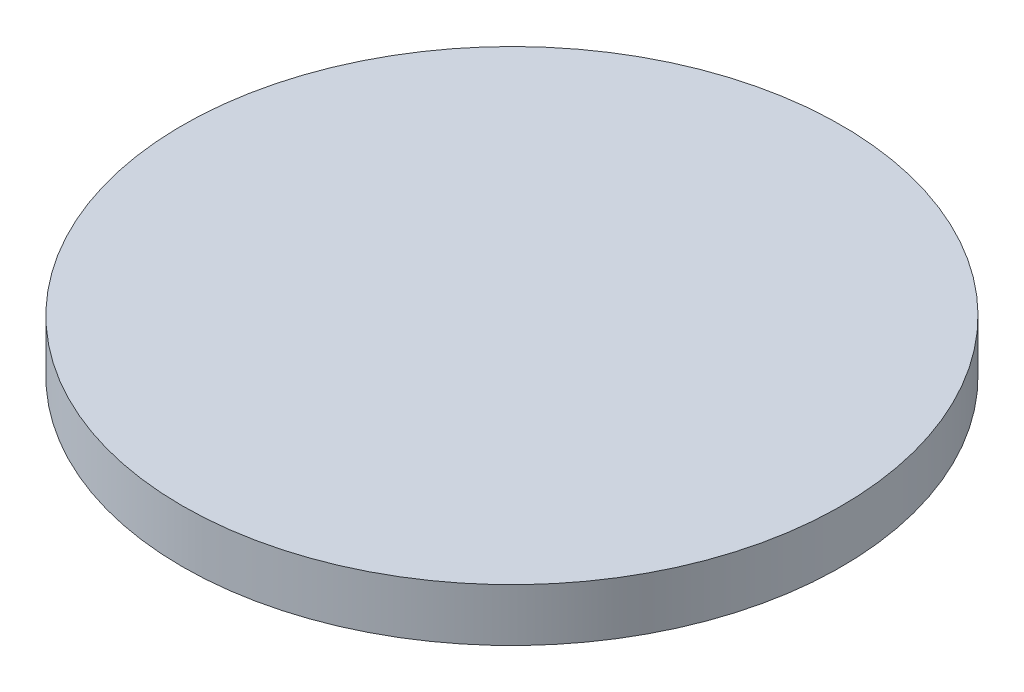
ISO-10303-21;
HEADER;
FILE_DESCRIPTION(('STEP AP214'),'2;1');
FILE_NAME('part.step','',(''),(''),'','','');
FILE_SCHEMA(('AUTOMOTIVE_DESIGN { 1 0 10303 214 1 1 1 1 }'));
ENDSEC;
DATA;
#1=APPLICATION_CONTEXT('core data for automotive mechanical design processes');
#2=APPLICATION_PROTOCOL_DEFINITION('international standard','automotive_design',2000,#1);
#3=PRODUCT_CONTEXT('',#1,'mechanical');
#4=PRODUCT('Part','Part','',(#3));
#5=PRODUCT_RELATED_PRODUCT_CATEGORY('part','',(#4));
#6=PRODUCT_DEFINITION_FORMATION('','',#4);
#7=PRODUCT_DEFINITION_CONTEXT('part definition',#1,'design');
#8=PRODUCT_DEFINITION('design','',#6,#7);
#9=PRODUCT_DEFINITION_SHAPE('','',#8);
#10=(LENGTH_UNIT() NAMED_UNIT(*) SI_UNIT(.MILLI.,.METRE.));
#11=(NAMED_UNIT(*) PLANE_ANGLE_UNIT() SI_UNIT($,.RADIAN.));
#12=(NAMED_UNIT(*) SI_UNIT($,.STERADIAN.) SOLID_ANGLE_UNIT());
#13=UNCERTAINTY_MEASURE_WITH_UNIT(LENGTH_MEASURE(1.E-05),#10,'distance_accuracy_value','');
#14=(GEOMETRIC_REPRESENTATION_CONTEXT(3) GLOBAL_UNCERTAINTY_ASSIGNED_CONTEXT((#13)) GLOBAL_UNIT_ASSIGNED_CONTEXT((#10,
#11,#12)) REPRESENTATION_CONTEXT('',''));
#15=CARTESIAN_POINT('',(0.,0.,0.));
#16=DIRECTION('',(0.,0.,1.));
#17=DIRECTION('',(1.,0.,0.));
#18=AXIS2_PLACEMENT_3D('',#15,#16,#17);
#19=CARTESIAN_POINT('',(0.,0.,0.));
#20=DIRECTION('',(0.,1.,0.));
#21=DIRECTION('',(0.,0.,1.));
#22=AXIS2_PLACEMENT_3D('',#19,#20,#21);
#23=PLANE('',#22);
#24=CARTESIAN_POINT('',(0.,0.,0.));
#25=DIRECTION('',(0.,1.,0.));
#26=DIRECTION('',(0.,0.,1.));
#27=AXIS2_PLACEMENT_3D('',#24,#25,#26);
#28=CIRCLE('',#27,25.);
#29=CARTESIAN_POINT('',(0.,0.,25.));
#30=VERTEX_POINT('',#29);
#31=EDGE_CURVE('E37',#30,#30,#28,.T.);
#32=ORIENTED_EDGE('',*,*,#31,.F.);
#33=EDGE_LOOP('',(#32));
#34=FACE_BOUND('',#33,.T.);
#35=CARTESIAN_POINT('',(0.,0.,0.));
#36=DIRECTION('',(0.,-1.,0.));
#37=DIRECTION('',(0.,0.,-1.));
#38=AXIS2_PLACEMENT_3D('',#35,#36,#37);
#39=CIRCLE('',#38,4.);
#40=CARTESIAN_POINT('',(0.,0.,-4.));
#41=VERTEX_POINT('',#40);
#42=EDGE_CURVE('E11',#41,#41,#39,.T.);
#43=ORIENTED_EDGE('',*,*,#42,.F.);
#44=EDGE_LOOP('',(#43));
#45=FACE_BOUND('',#44,.T.);
#46=ADVANCED_FACE('F33',(#34,#45),#23,.F.);
#47=CARTESIAN_POINT('',(0.,4.,0.));
#48=DIRECTION('',(0.,-1.,0.));
#49=DIRECTION('',(0.,0.,-1.));
#50=AXIS2_PLACEMENT_3D('',#47,#48,#49);
#51=CYLINDRICAL_SURFACE('',#50,25.);
#52=CARTESIAN_POINT('',(0.,4.,0.));
#53=DIRECTION('',(0.,1.,0.));
#54=DIRECTION('',(0.,0.,1.));
#55=AXIS2_PLACEMENT_3D('',#52,#53,#54);
#56=CIRCLE('',#55,25.);
#57=CARTESIAN_POINT('',(0.,4.,25.));
#58=VERTEX_POINT('',#57);
#59=EDGE_CURVE('E42',#58,#58,#56,.T.);
#60=ORIENTED_EDGE('',*,*,#59,.F.);
#61=EDGE_LOOP('',(#60));
#62=FACE_BOUND('',#61,.T.);
#63=ORIENTED_EDGE('',*,*,#31,.T.);
#64=EDGE_LOOP('',(#63));
#65=FACE_BOUND('',#64,.T.);
#66=ADVANCED_FACE('F35',(#62,#65),#51,.T.);
#67=CARTESIAN_POINT('',(0.,4.,0.));
#68=DIRECTION('',(0.,1.,0.));
#69=DIRECTION('',(0.,0.,1.));
#70=AXIS2_PLACEMENT_3D('',#67,#68,#69);
#71=PLANE('',#70);
#72=ORIENTED_EDGE('',*,*,#59,.T.);
#73=EDGE_LOOP('',(#72));
#74=FACE_BOUND('',#73,.T.);
#75=ADVANCED_FACE('F240',(#74),#71,.T.);
#76=CARTESIAN_POINT('',(0.,-8.,0.));
#77=DIRECTION('',(0.,-1.,0.));
#78=DIRECTION('',(0.,0.,-1.));
#79=AXIS2_PLACEMENT_3D('',#76,#77,#78);
#80=PLANE('',#79);
#81=CARTESIAN_POINT('',(0.,-8.,0.));
#82=DIRECTION('',(0.,-1.,0.));
#83=DIRECTION('',(0.,0.,-1.));
#84=AXIS2_PLACEMENT_3D('',#81,#82,#83);
#85=CIRCLE('',#84,4.);
#86=CARTESIAN_POINT('',(0.,-8.,-4.));
#87=VERTEX_POINT('',#86);
#88=EDGE_CURVE('E139',#87,#87,#85,.T.);
#89=ORIENTED_EDGE('',*,*,#88,.T.);
#90=EDGE_LOOP('',(#89));
#91=FACE_BOUND('',#90,.T.);
#92=DIRECTION('',(1.,0.,0.));
#93=VECTOR('',#92,1.);
#94=CARTESIAN_POINT('',(-2.25831795812724,-8.,-0.95));
#95=LINE('',#94,#93);
#96=CARTESIAN_POINT('',(-2.25831795812724,-8.,-0.95));
#97=VERTEX_POINT('',#96);
#98=CARTESIAN_POINT('',(-0.95,-8.,-0.95));
#99=VERTEX_POINT('',#98);
#100=EDGE_CURVE('E131',#97,#99,#95,.T.);
#101=ORIENTED_EDGE('',*,*,#100,.F.);
#102=CARTESIAN_POINT('',(0.,-8.,0.));
#103=DIRECTION('',(0.,-1.,0.));
#104=DIRECTION('',(0.,0.,-1.));
#105=AXIS2_PLACEMENT_3D('',#102,#103,#104);
#106=CIRCLE('',#105,2.45);
#107=CARTESIAN_POINT('',(-2.25831795812724,-8.,0.95));
#108=VERTEX_POINT('',#107);
#109=EDGE_CURVE('E123',#108,#97,#106,.T.);
#110=ORIENTED_EDGE('',*,*,#109,.F.);
#111=DIRECTION('',(-1.,0.,0.));
#112=VECTOR('',#111,1.);
#113=CARTESIAN_POINT('',(-2.25831795812724,-8.,0.95));
#114=LINE('',#113,#112);
#115=CARTESIAN_POINT('',(-0.95,-8.,0.95));
#116=VERTEX_POINT('',#115);
#117=EDGE_CURVE('E165',#116,#108,#114,.T.);
#118=ORIENTED_EDGE('',*,*,#117,.F.);
#119=DIRECTION('',(0.,0.,-1.));
#120=VECTOR('',#119,1.);
#121=CARTESIAN_POINT('',(-0.95,-8.,2.25831795812724));
#122=LINE('',#121,#120);
#123=CARTESIAN_POINT('',(-0.95,-8.,2.25831795812724));
#124=VERTEX_POINT('',#123);
#125=EDGE_CURVE('E163',#124,#116,#122,.T.);
#126=ORIENTED_EDGE('',*,*,#125,.F.);
#127=CARTESIAN_POINT('',(0.,-8.,0.));
#128=DIRECTION('',(0.,-1.,0.));
#129=DIRECTION('',(0.,0.,-1.));
#130=AXIS2_PLACEMENT_3D('',#127,#128,#129);
#131=CIRCLE('',#130,2.45);
#132=CARTESIAN_POINT('',(0.95,-8.,2.25831795812724));
#133=VERTEX_POINT('',#132);
#134=EDGE_CURVE('E161',#133,#124,#131,.T.);
#135=ORIENTED_EDGE('',*,*,#134,.F.);
#136=DIRECTION('',(0.,0.,1.));
#137=VECTOR('',#136,1.);
#138=CARTESIAN_POINT('',(0.95,-8.,2.25831795812724));
#139=LINE('',#138,#137);
#140=CARTESIAN_POINT('',(0.95,-8.,0.95));
#141=VERTEX_POINT('',#140);
#142=EDGE_CURVE('E159',#141,#133,#139,.T.);
#143=ORIENTED_EDGE('',*,*,#142,.F.);
#144=DIRECTION('',(-1.,0.,0.));
#145=VECTOR('',#144,1.);
#146=CARTESIAN_POINT('',(2.25831795812724,-8.,0.95));
#147=LINE('',#146,#145);
#148=CARTESIAN_POINT('',(2.25831795812724,-8.,0.95));
#149=VERTEX_POINT('',#148);
#150=EDGE_CURVE('E157',#149,#141,#147,.T.);
#151=ORIENTED_EDGE('',*,*,#150,.F.);
#152=CARTESIAN_POINT('',(0.,-8.,0.));
#153=DIRECTION('',(0.,-1.,0.));
#154=DIRECTION('',(0.,0.,-1.));
#155=AXIS2_PLACEMENT_3D('',#152,#153,#154);
#156=CIRCLE('',#155,2.45);
#157=CARTESIAN_POINT('',(2.25831795812724,-8.,-0.95));
#158=VERTEX_POINT('',#157);
#159=EDGE_CURVE('E155',#158,#149,#156,.T.);
#160=ORIENTED_EDGE('',*,*,#159,.F.);
#161=DIRECTION('',(1.,0.,0.));
#162=VECTOR('',#161,1.);
#163=CARTESIAN_POINT('',(2.25831795812724,-8.,-0.95));
#164=LINE('',#163,#162);
#165=CARTESIAN_POINT('',(0.95,-8.,-0.95));
#166=VERTEX_POINT('',#165);
#167=EDGE_CURVE('E153',#166,#158,#164,.T.);
#168=ORIENTED_EDGE('',*,*,#167,.F.);
#169=DIRECTION('',(0.,0.,1.));
#170=VECTOR('',#169,1.);
#171=CARTESIAN_POINT('',(0.95,-8.,-2.25831795812724));
#172=LINE('',#171,#170);
#173=CARTESIAN_POINT('',(0.95,-8.,-2.25831795812724));
#174=VERTEX_POINT('',#173);
#175=EDGE_CURVE('E151',#174,#166,#172,.T.);
#176=ORIENTED_EDGE('',*,*,#175,.F.);
#177=CARTESIAN_POINT('',(0.,-8.,0.));
#178=DIRECTION('',(0.,-1.,0.));
#179=DIRECTION('',(0.,0.,-1.));
#180=AXIS2_PLACEMENT_3D('',#177,#178,#179);
#181=CIRCLE('',#180,2.45);
#182=CARTESIAN_POINT('',(-0.950000000000001,-8.,-2.25831795812724));
#183=VERTEX_POINT('',#182);
#184=EDGE_CURVE('E147',#183,#174,#181,.T.);
#185=ORIENTED_EDGE('',*,*,#184,.F.);
#186=DIRECTION('',(0.,0.,-1.));
#187=VECTOR('',#186,1.);
#188=CARTESIAN_POINT('',(-0.95,-8.,-2.25831795812724));
#189=LINE('',#188,#187);
#190=EDGE_CURVE('E145',#99,#183,#189,.T.);
#191=ORIENTED_EDGE('',*,*,#190,.F.);
#192=EDGE_LOOP('',(#101,#110,#118,#126,#135,#143,#151,#160,#168,#176,#185,#191));
#193=FACE_BOUND('',#192,.T.);
#194=ADVANCED_FACE('F143',(#91,#193),#80,.T.);
#195=CARTESIAN_POINT('',(0.,-8.,0.));
#196=DIRECTION('',(0.,1.,0.));
#197=DIRECTION('',(0.,0.,1.));
#198=AXIS2_PLACEMENT_3D('',#195,#196,#197);
#199=CYLINDRICAL_SURFACE('',#198,4.);
#200=ORIENTED_EDGE('',*,*,#88,.F.);
#201=EDGE_LOOP('',(#200));
#202=FACE_BOUND('',#201,.T.);
#203=ORIENTED_EDGE('',*,*,#42,.T.);
#204=EDGE_LOOP('',(#203));
#205=FACE_BOUND('',#204,.T.);
#206=ADVANCED_FACE('F231',(#202,#205),#199,.T.);
#207=CARTESIAN_POINT('',(0.,-8.,0.));
#208=DIRECTION('',(0.,1.,0.));
#209=DIRECTION('',(0.,0.,1.));
#210=AXIS2_PLACEMENT_3D('',#207,#208,#209);
#211=CYLINDRICAL_SURFACE('',#210,2.45);
#212=CARTESIAN_POINT('',(0.,0.,0.));
#213=DIRECTION('',(0.,-1.,0.));
#214=DIRECTION('',(0.,0.,-1.));
#215=AXIS2_PLACEMENT_3D('',#212,#213,#214);
#216=CIRCLE('',#215,2.45);
#217=CARTESIAN_POINT('',(-2.25831795812724,0.,0.95));
#218=VERTEX_POINT('',#217);
#219=CARTESIAN_POINT('',(-2.25831795812724,0.,-0.95));
#220=VERTEX_POINT('',#219);
#221=EDGE_CURVE('E167',#218,#220,#216,.T.);
#222=ORIENTED_EDGE('',*,*,#221,.F.);
#223=DIRECTION('',(0.,1.,0.));
#224=VECTOR('',#223,1.);
#225=CARTESIAN_POINT('',(-2.25831795812724,-8.,0.95));
#226=LINE('',#225,#224);
#227=EDGE_CURVE('E50',#108,#218,#226,.T.);
#228=ORIENTED_EDGE('',*,*,#227,.F.);
#229=ORIENTED_EDGE('',*,*,#109,.T.);
#230=DIRECTION('',(0.,1.,0.));
#231=VECTOR('',#230,1.);
#232=CARTESIAN_POINT('',(-2.25831795812724,-8.,-0.95));
#233=LINE('',#232,#231);
#234=EDGE_CURVE('E126',#97,#220,#233,.T.);
#235=ORIENTED_EDGE('',*,*,#234,.T.);
#236=EDGE_LOOP('',(#222,#228,#229,#235));
#237=FACE_BOUND('',#236,.T.);
#238=ADVANCED_FACE('F125',(#237),#211,.F.);
#239=CARTESIAN_POINT('',(-2.25831795812724,-8.,-0.95));
#240=DIRECTION('',(0.,0.,1.));
#241=DIRECTION('',(1.,0.,0.));
#242=AXIS2_PLACEMENT_3D('',#239,#240,#241);
#243=PLANE('',#242);
#244=DIRECTION('',(1.,0.,0.));
#245=VECTOR('',#244,1.);
#246=CARTESIAN_POINT('',(-2.25831795812724,0.,-0.95));
#247=LINE('',#246,#245);
#248=CARTESIAN_POINT('',(-0.95,0.,-0.95));
#249=VERTEX_POINT('',#248);
#250=EDGE_CURVE('E138',#220,#249,#247,.T.);
#251=ORIENTED_EDGE('',*,*,#250,.F.);
#252=ORIENTED_EDGE('',*,*,#234,.F.);
#253=ORIENTED_EDGE('',*,*,#100,.T.);
#254=DIRECTION('',(0.,1.,0.));
#255=VECTOR('',#254,1.);
#256=CARTESIAN_POINT('',(-0.95,-8.,-0.95));
#257=LINE('',#256,#255);
#258=EDGE_CURVE('E140',#99,#249,#257,.T.);
#259=ORIENTED_EDGE('',*,*,#258,.T.);
#260=EDGE_LOOP('',(#251,#252,#253,#259));
#261=FACE_BOUND('',#260,.T.);
#262=ADVANCED_FACE('F135',(#261),#243,.T.);
#263=CARTESIAN_POINT('',(-0.95,-8.,-2.25831795812724));
#264=DIRECTION('',(1.,0.,0.));
#265=DIRECTION('',(0.,0.,-1.));
#266=AXIS2_PLACEMENT_3D('',#263,#264,#265);
#267=PLANE('',#266);
#268=DIRECTION('',(0.,0.,-1.));
#269=VECTOR('',#268,1.);
#270=CARTESIAN_POINT('',(-0.95,0.,-2.25831795812724));
#271=LINE('',#270,#269);
#272=CARTESIAN_POINT('',(-0.950000000000001,0.,-2.25831795812724));
#273=VERTEX_POINT('',#272);
#274=EDGE_CURVE('E170',#249,#273,#271,.T.);
#275=ORIENTED_EDGE('',*,*,#274,.F.);
#276=ORIENTED_EDGE('',*,*,#258,.F.);
#277=ORIENTED_EDGE('',*,*,#190,.T.);
#278=DIRECTION('',(0.,1.,0.));
#279=VECTOR('',#278,1.);
#280=CARTESIAN_POINT('',(-0.950000000000001,-8.,-2.25831795812724));
#281=LINE('',#280,#279);
#282=EDGE_CURVE('E215',#183,#273,#281,.T.);
#283=ORIENTED_EDGE('',*,*,#282,.T.);
#284=EDGE_LOOP('',(#275,#276,#277,#283));
#285=FACE_BOUND('',#284,.T.);
#286=ADVANCED_FACE('F294',(#285),#267,.T.);
#287=CARTESIAN_POINT('',(0.,-8.,0.));
#288=DIRECTION('',(0.,1.,0.));
#289=DIRECTION('',(0.,0.,1.));
#290=AXIS2_PLACEMENT_3D('',#287,#288,#289);
#291=CYLINDRICAL_SURFACE('',#290,2.45);
#292=CARTESIAN_POINT('',(0.,0.,0.));
#293=DIRECTION('',(0.,-1.,0.));
#294=DIRECTION('',(0.,0.,-1.));
#295=AXIS2_PLACEMENT_3D('',#292,#293,#294);
#296=CIRCLE('',#295,2.45);
#297=CARTESIAN_POINT('',(0.95,0.,-2.25831795812724));
#298=VERTEX_POINT('',#297);
#299=EDGE_CURVE('E173',#273,#298,#296,.T.);
#300=ORIENTED_EDGE('',*,*,#299,.F.);
#301=ORIENTED_EDGE('',*,*,#282,.F.);
#302=ORIENTED_EDGE('',*,*,#184,.T.);
#303=DIRECTION('',(0.,1.,0.));
#304=VECTOR('',#303,1.);
#305=CARTESIAN_POINT('',(0.95,-8.,-2.25831795812724));
#306=LINE('',#305,#304);
#307=EDGE_CURVE('E213',#174,#298,#306,.T.);
#308=ORIENTED_EDGE('',*,*,#307,.T.);
#309=EDGE_LOOP('',(#300,#301,#302,#308));
#310=FACE_BOUND('',#309,.T.);
#311=ADVANCED_FACE('F291',(#310),#291,.F.);
#312=CARTESIAN_POINT('',(0.95,-8.,-2.25831795812724));
#313=DIRECTION('',(-1.,0.,0.));
#314=DIRECTION('',(0.,0.,1.));
#315=AXIS2_PLACEMENT_3D('',#312,#313,#314);
#316=PLANE('',#315);
#317=DIRECTION('',(0.,0.,1.));
#318=VECTOR('',#317,1.);
#319=CARTESIAN_POINT('',(0.95,0.,-2.25831795812724));
#320=LINE('',#319,#318);
#321=CARTESIAN_POINT('',(0.95,0.,-0.95));
#322=VERTEX_POINT('',#321);
#323=EDGE_CURVE('E176',#298,#322,#320,.T.);
#324=ORIENTED_EDGE('',*,*,#323,.F.);
#325=ORIENTED_EDGE('',*,*,#307,.F.);
#326=ORIENTED_EDGE('',*,*,#175,.T.);
#327=DIRECTION('',(0.,1.,0.));
#328=VECTOR('',#327,1.);
#329=CARTESIAN_POINT('',(0.95,-8.,-0.95));
#330=LINE('',#329,#328);
#331=EDGE_CURVE('E211',#166,#322,#330,.T.);
#332=ORIENTED_EDGE('',*,*,#331,.T.);
#333=EDGE_LOOP('',(#324,#325,#326,#332));
#334=FACE_BOUND('',#333,.T.);
#335=ADVANCED_FACE('F286',(#334),#316,.T.);
#336=CARTESIAN_POINT('',(2.25831795812724,-8.,-0.95));
#337=DIRECTION('',(0.,0.,1.));
#338=DIRECTION('',(1.,0.,0.));
#339=AXIS2_PLACEMENT_3D('',#336,#337,#338);
#340=PLANE('',#339);
#341=DIRECTION('',(1.,0.,0.));
#342=VECTOR('',#341,1.);
#343=CARTESIAN_POINT('',(2.25831795812724,0.,-0.95));
#344=LINE('',#343,#342);
#345=CARTESIAN_POINT('',(2.25831795812724,0.,-0.95));
#346=VERTEX_POINT('',#345);
#347=EDGE_CURVE('E179',#322,#346,#344,.T.);
#348=ORIENTED_EDGE('',*,*,#347,.F.);
#349=ORIENTED_EDGE('',*,*,#331,.F.);
#350=ORIENTED_EDGE('',*,*,#167,.T.);
#351=DIRECTION('',(0.,1.,0.));
#352=VECTOR('',#351,1.);
#353=CARTESIAN_POINT('',(2.25831795812724,-8.,-0.95));
#354=LINE('',#353,#352);
#355=EDGE_CURVE('E209',#158,#346,#354,.T.);
#356=ORIENTED_EDGE('',*,*,#355,.T.);
#357=EDGE_LOOP('',(#348,#349,#350,#356));
#358=FACE_BOUND('',#357,.T.);
#359=ADVANCED_FACE('F282',(#358),#340,.T.);
#360=CARTESIAN_POINT('',(0.,-8.,0.));
#361=DIRECTION('',(0.,1.,0.));
#362=DIRECTION('',(0.,0.,1.));
#363=AXIS2_PLACEMENT_3D('',#360,#361,#362);
#364=CYLINDRICAL_SURFACE('',#363,2.45);
#365=CARTESIAN_POINT('',(0.,0.,0.));
#366=DIRECTION('',(0.,-1.,0.));
#367=DIRECTION('',(0.,0.,-1.));
#368=AXIS2_PLACEMENT_3D('',#365,#366,#367);
#369=CIRCLE('',#368,2.45);
#370=CARTESIAN_POINT('',(2.25831795812724,0.,0.95));
#371=VERTEX_POINT('',#370);
#372=EDGE_CURVE('E182',#346,#371,#369,.T.);
#373=ORIENTED_EDGE('',*,*,#372,.F.);
#374=ORIENTED_EDGE('',*,*,#355,.F.);
#375=ORIENTED_EDGE('',*,*,#159,.T.);
#376=DIRECTION('',(0.,1.,0.));
#377=VECTOR('',#376,1.);
#378=CARTESIAN_POINT('',(2.25831795812724,-8.,0.95));
#379=LINE('',#378,#377);
#380=EDGE_CURVE('E207',#149,#371,#379,.T.);
#381=ORIENTED_EDGE('',*,*,#380,.T.);
#382=EDGE_LOOP('',(#373,#374,#375,#381));
#383=FACE_BOUND('',#382,.T.);
#384=ADVANCED_FACE('F279',(#383),#364,.F.);
#385=CARTESIAN_POINT('',(2.25831795812724,-8.,0.95));
#386=DIRECTION('',(0.,0.,-1.));
#387=DIRECTION('',(-1.,0.,0.));
#388=AXIS2_PLACEMENT_3D('',#385,#386,#387);
#389=PLANE('',#388);
#390=DIRECTION('',(-1.,0.,0.));
#391=VECTOR('',#390,1.);
#392=CARTESIAN_POINT('',(2.25831795812724,0.,0.95));
#393=LINE('',#392,#391);
#394=CARTESIAN_POINT('',(0.95,0.,0.95));
#395=VERTEX_POINT('',#394);
#396=EDGE_CURVE('E185',#371,#395,#393,.T.);
#397=ORIENTED_EDGE('',*,*,#396,.F.);
#398=ORIENTED_EDGE('',*,*,#380,.F.);
#399=ORIENTED_EDGE('',*,*,#150,.T.);
#400=DIRECTION('',(0.,1.,0.));
#401=VECTOR('',#400,1.);
#402=CARTESIAN_POINT('',(0.95,-8.,0.95));
#403=LINE('',#402,#401);
#404=EDGE_CURVE('E205',#141,#395,#403,.T.);
#405=ORIENTED_EDGE('',*,*,#404,.T.);
#406=EDGE_LOOP('',(#397,#398,#399,#405));
#407=FACE_BOUND('',#406,.T.);
#408=ADVANCED_FACE('F271',(#407),#389,.T.);
#409=CARTESIAN_POINT('',(0.95,-8.,2.25831795812724));
#410=DIRECTION('',(-1.,0.,0.));
#411=DIRECTION('',(0.,0.,1.));
#412=AXIS2_PLACEMENT_3D('',#409,#410,#411);
#413=PLANE('',#412);
#414=DIRECTION('',(0.,0.,1.));
#415=VECTOR('',#414,1.);
#416=CARTESIAN_POINT('',(0.95,0.,2.25831795812724));
#417=LINE('',#416,#415);
#418=CARTESIAN_POINT('',(0.95,0.,2.25831795812724));
#419=VERTEX_POINT('',#418);
#420=EDGE_CURVE('E188',#395,#419,#417,.T.);
#421=ORIENTED_EDGE('',*,*,#420,.F.);
#422=ORIENTED_EDGE('',*,*,#404,.F.);
#423=ORIENTED_EDGE('',*,*,#142,.T.);
#424=DIRECTION('',(0.,1.,0.));
#425=VECTOR('',#424,1.);
#426=CARTESIAN_POINT('',(0.95,-8.,2.25831795812724));
#427=LINE('',#426,#425);
#428=EDGE_CURVE('E203',#133,#419,#427,.T.);
#429=ORIENTED_EDGE('',*,*,#428,.T.);
#430=EDGE_LOOP('',(#421,#422,#423,#429));
#431=FACE_BOUND('',#430,.T.);
#432=ADVANCED_FACE('F267',(#431),#413,.T.);
#433=CARTESIAN_POINT('',(0.,-8.,0.));
#434=DIRECTION('',(0.,1.,0.));
#435=DIRECTION('',(0.,0.,1.));
#436=AXIS2_PLACEMENT_3D('',#433,#434,#435);
#437=CYLINDRICAL_SURFACE('',#436,2.45);
#438=CARTESIAN_POINT('',(0.,0.,0.));
#439=DIRECTION('',(0.,-1.,0.));
#440=DIRECTION('',(0.,0.,-1.));
#441=AXIS2_PLACEMENT_3D('',#438,#439,#440);
#442=CIRCLE('',#441,2.45);
#443=CARTESIAN_POINT('',(-0.95,0.,2.25831795812724));
#444=VERTEX_POINT('',#443);
#445=EDGE_CURVE('E191',#419,#444,#442,.T.);
#446=ORIENTED_EDGE('',*,*,#445,.F.);
#447=ORIENTED_EDGE('',*,*,#428,.F.);
#448=ORIENTED_EDGE('',*,*,#134,.T.);
#449=DIRECTION('',(0.,1.,0.));
#450=VECTOR('',#449,1.);
#451=CARTESIAN_POINT('',(-0.95,-8.,2.25831795812724));
#452=LINE('',#451,#450);
#453=EDGE_CURVE('E201',#124,#444,#452,.T.);
#454=ORIENTED_EDGE('',*,*,#453,.T.);
#455=EDGE_LOOP('',(#446,#447,#448,#454));
#456=FACE_BOUND('',#455,.T.);
#457=ADVANCED_FACE('F264',(#456),#437,.F.);
#458=CARTESIAN_POINT('',(-0.95,-8.,2.25831795812724));
#459=DIRECTION('',(1.,0.,0.));
#460=DIRECTION('',(0.,0.,-1.));
#461=AXIS2_PLACEMENT_3D('',#458,#459,#460);
#462=PLANE('',#461);
#463=DIRECTION('',(0.,0.,-1.));
#464=VECTOR('',#463,1.);
#465=CARTESIAN_POINT('',(-0.95,0.,2.25831795812724));
#466=LINE('',#465,#464);
#467=CARTESIAN_POINT('',(-0.95,0.,0.95));
#468=VERTEX_POINT('',#467);
#469=EDGE_CURVE('E194',#444,#468,#466,.T.);
#470=ORIENTED_EDGE('',*,*,#469,.F.);
#471=ORIENTED_EDGE('',*,*,#453,.F.);
#472=ORIENTED_EDGE('',*,*,#125,.T.);
#473=DIRECTION('',(0.,1.,0.));
#474=VECTOR('',#473,1.);
#475=CARTESIAN_POINT('',(-0.95,-8.,0.95));
#476=LINE('',#475,#474);
#477=EDGE_CURVE('E55',#116,#468,#476,.T.);
#478=ORIENTED_EDGE('',*,*,#477,.T.);
#479=EDGE_LOOP('',(#470,#471,#472,#478));
#480=FACE_BOUND('',#479,.T.);
#481=ADVANCED_FACE('F252',(#480),#462,.T.);
#482=CARTESIAN_POINT('',(-2.25831795812724,-8.,0.95));
#483=DIRECTION('',(0.,0.,-1.));
#484=DIRECTION('',(-1.,0.,0.));
#485=AXIS2_PLACEMENT_3D('',#482,#483,#484);
#486=PLANE('',#485);
#487=DIRECTION('',(-1.,0.,0.));
#488=VECTOR('',#487,1.);
#489=CARTESIAN_POINT('',(-2.25831795812724,0.,0.95));
#490=LINE('',#489,#488);
#491=EDGE_CURVE('E132',#468,#218,#490,.T.);
#492=ORIENTED_EDGE('',*,*,#491,.F.);
#493=ORIENTED_EDGE('',*,*,#477,.F.);
#494=ORIENTED_EDGE('',*,*,#117,.T.);
#495=ORIENTED_EDGE('',*,*,#227,.T.);
#496=EDGE_LOOP('',(#492,#493,#494,#495));
#497=FACE_BOUND('',#496,.T.);
#498=ADVANCED_FACE('F247',(#497),#486,.T.);
#499=ORIENTED_EDGE('',*,*,#491,.T.);
#500=ORIENTED_EDGE('',*,*,#221,.T.);
#501=ORIENTED_EDGE('',*,*,#250,.T.);
#502=ORIENTED_EDGE('',*,*,#274,.T.);
#503=ORIENTED_EDGE('',*,*,#299,.T.);
#504=ORIENTED_EDGE('',*,*,#323,.T.);
#505=ORIENTED_EDGE('',*,*,#347,.T.);
#506=ORIENTED_EDGE('',*,*,#372,.T.);
#507=ORIENTED_EDGE('',*,*,#396,.T.);
#508=ORIENTED_EDGE('',*,*,#420,.T.);
#509=ORIENTED_EDGE('',*,*,#445,.T.);
#510=ORIENTED_EDGE('',*,*,#469,.T.);
#511=EDGE_LOOP('',(#499,#500,#501,#502,#503,#504,#505,#506,#507,#508,#509,#510));
#512=FACE_BOUND('',#511,.T.);
#513=ADVANCED_FACE('F228',(#512),#23,.F.);
#514=CLOSED_SHELL('',(#46,#66,#75,#194,#206,#238,#262,#286,#311,#335,#359,#384,#408,#432,#457,
#481,#498,#513));
#515=MANIFOLD_SOLID_BREP('B2',#514);
#516=ADVANCED_BREP_SHAPE_REPRESENTATION('',(#18,#515),#14);
#517=SHAPE_DEFINITION_REPRESENTATION(#9,#516);
ENDSEC;
END-ISO-10303-21;
